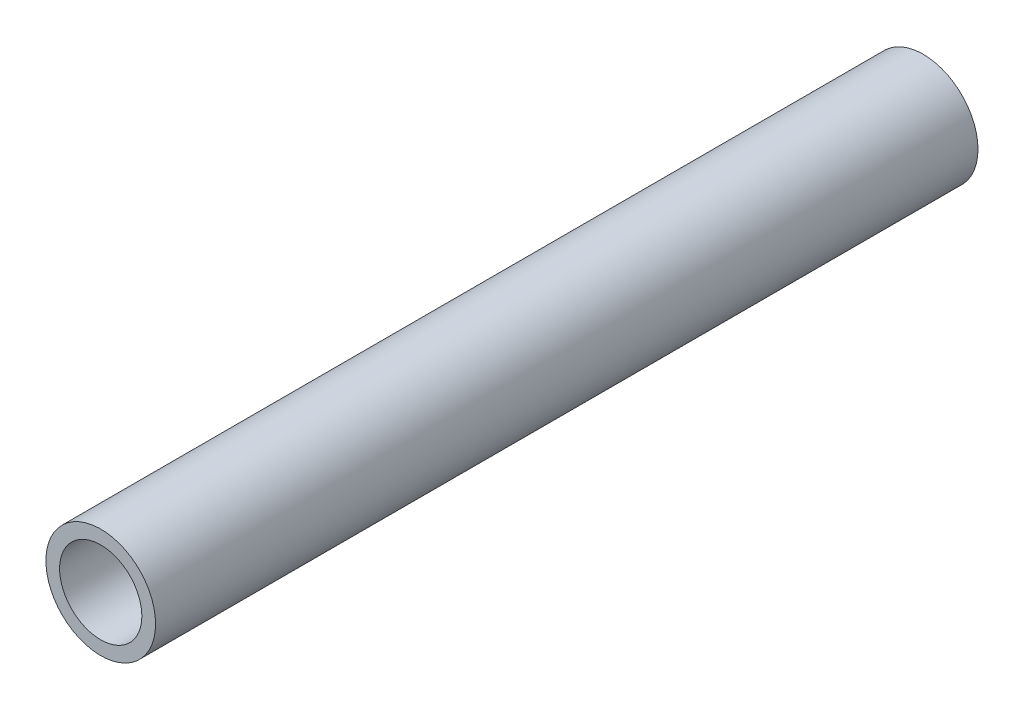
ISO-10303-21;
HEADER;
FILE_DESCRIPTION(('STEP AP214'),'2;1');
FILE_NAME('part.step','',(''),(''),'','','');
FILE_SCHEMA(('AUTOMOTIVE_DESIGN { 1 0 10303 214 1 1 1 1 }'));
ENDSEC;
DATA;
#1=APPLICATION_CONTEXT('core data for automotive mechanical design processes');
#2=APPLICATION_PROTOCOL_DEFINITION('international standard','automotive_design',2000,#1);
#3=PRODUCT_CONTEXT('',#1,'mechanical');
#4=PRODUCT('Part','Part','',(#3));
#5=PRODUCT_RELATED_PRODUCT_CATEGORY('part','',(#4));
#6=PRODUCT_DEFINITION_FORMATION('','',#4);
#7=PRODUCT_DEFINITION_CONTEXT('part definition',#1,'design');
#8=PRODUCT_DEFINITION('design','',#6,#7);
#9=PRODUCT_DEFINITION_SHAPE('','',#8);
#10=(LENGTH_UNIT() NAMED_UNIT(*) SI_UNIT(.MILLI.,.METRE.));
#11=(NAMED_UNIT(*) PLANE_ANGLE_UNIT() SI_UNIT($,.RADIAN.));
#12=(NAMED_UNIT(*) SI_UNIT($,.STERADIAN.) SOLID_ANGLE_UNIT());
#13=UNCERTAINTY_MEASURE_WITH_UNIT(LENGTH_MEASURE(1.E-05),#10,'distance_accuracy_value','');
#14=(GEOMETRIC_REPRESENTATION_CONTEXT(3) GLOBAL_UNCERTAINTY_ASSIGNED_CONTEXT((#13)) GLOBAL_UNIT_ASSIGNED_CONTEXT((#10,
#11,#12)) REPRESENTATION_CONTEXT('',''));
#15=CARTESIAN_POINT('',(0.,0.,0.));
#16=DIRECTION('',(0.,0.,1.));
#17=DIRECTION('',(1.,0.,0.));
#18=AXIS2_PLACEMENT_3D('',#15,#16,#17);
#19=CARTESIAN_POINT('',(0.,0.,60.));
#20=DIRECTION('',(0.,0.,-1.));
#21=DIRECTION('',(-1.,0.,0.));
#22=AXIS2_PLACEMENT_3D('',#19,#20,#21);
#23=CYLINDRICAL_SURFACE('',#22,4.);
#24=CARTESIAN_POINT('',(0.,0.,60.));
#25=DIRECTION('',(0.,0.,1.));
#26=DIRECTION('',(1.,0.,0.));
#27=AXIS2_PLACEMENT_3D('',#24,#25,#26);
#28=CIRCLE('',#27,4.);
#29=CARTESIAN_POINT('',(4.,0.,60.));
#30=VERTEX_POINT('',#29);
#31=EDGE_CURVE('E10',#30,#30,#28,.T.);
#32=ORIENTED_EDGE('',*,*,#31,.F.);
#33=EDGE_LOOP('',(#32));
#34=FACE_BOUND('',#33,.T.);
#35=CARTESIAN_POINT('',(0.,0.,0.));
#36=DIRECTION('',(0.,0.,1.));
#37=DIRECTION('',(1.,0.,0.));
#38=AXIS2_PLACEMENT_3D('',#35,#36,#37);
#39=CIRCLE('',#38,4.);
#40=CARTESIAN_POINT('',(4.,0.,0.));
#41=VERTEX_POINT('',#40);
#42=EDGE_CURVE('E40',#41,#41,#39,.T.);
#43=ORIENTED_EDGE('',*,*,#42,.T.);
#44=EDGE_LOOP('',(#43));
#45=FACE_BOUND('',#44,.T.);
#46=ADVANCED_FACE('F37',(#34,#45),#23,.T.);
#47=CARTESIAN_POINT('',(0.,0.,60.));
#48=DIRECTION('',(0.,0.,1.));
#49=DIRECTION('',(1.,0.,0.));
#50=AXIS2_PLACEMENT_3D('',#47,#48,#49);
#51=PLANE('',#50);
#52=CARTESIAN_POINT('',(0.,0.,60.));
#53=DIRECTION('',(0.,0.,1.));
#54=DIRECTION('',(1.,0.,0.));
#55=AXIS2_PLACEMENT_3D('',#52,#53,#54);
#56=CIRCLE('',#55,3.);
#57=CARTESIAN_POINT('',(3.,0.,60.));
#58=VERTEX_POINT('',#57);
#59=EDGE_CURVE('E51',#58,#58,#56,.T.);
#60=ORIENTED_EDGE('',*,*,#59,.F.);
#61=EDGE_LOOP('',(#60));
#62=FACE_BOUND('',#61,.T.);
#63=ORIENTED_EDGE('',*,*,#31,.T.);
#64=EDGE_LOOP('',(#63));
#65=FACE_BOUND('',#64,.T.);
#66=ADVANCED_FACE('F68',(#62,#65),#51,.T.);
#67=CARTESIAN_POINT('',(0.,0.,0.));
#68=DIRECTION('',(0.,0.,1.));
#69=DIRECTION('',(1.,0.,0.));
#70=AXIS2_PLACEMENT_3D('',#67,#68,#69);
#71=PLANE('',#70);
#72=ORIENTED_EDGE('',*,*,#42,.F.);
#73=EDGE_LOOP('',(#72));
#74=FACE_BOUND('',#73,.T.);
#75=ADVANCED_FACE('F64',(#74),#71,.F.);
#76=CARTESIAN_POINT('',(0.,0.,55.));
#77=DIRECTION('',(0.,0.,1.));
#78=DIRECTION('',(1.,0.,0.));
#79=AXIS2_PLACEMENT_3D('',#76,#77,#78);
#80=CYLINDRICAL_SURFACE('',#79,3.);
#81=CARTESIAN_POINT('',(0.,0.,55.));
#82=DIRECTION('',(0.,0.,1.));
#83=DIRECTION('',(1.,0.,0.));
#84=AXIS2_PLACEMENT_3D('',#81,#82,#83);
#85=CIRCLE('',#84,3.);
#86=CARTESIAN_POINT('',(3.,0.,55.));
#87=VERTEX_POINT('',#86);
#88=EDGE_CURVE('E49',#87,#87,#85,.T.);
#89=ORIENTED_EDGE('',*,*,#88,.F.);
#90=EDGE_LOOP('',(#89));
#91=FACE_BOUND('',#90,.T.);
#92=ORIENTED_EDGE('',*,*,#59,.T.);
#93=EDGE_LOOP('',(#92));
#94=FACE_BOUND('',#93,.T.);
#95=ADVANCED_FACE('F61',(#91,#94),#80,.F.);
#96=CARTESIAN_POINT('',(0.,0.,55.));
#97=DIRECTION('',(0.,0.,1.));
#98=DIRECTION('',(1.,0.,0.));
#99=AXIS2_PLACEMENT_3D('',#96,#97,#98);
#100=PLANE('',#99);
#101=ORIENTED_EDGE('',*,*,#88,.T.);
#102=EDGE_LOOP('',(#101));
#103=FACE_BOUND('',#102,.T.);
#104=ADVANCED_FACE('F59',(#103),#100,.T.);
#105=CLOSED_SHELL('',(#46,#66,#75,#95,#104));
#106=MANIFOLD_SOLID_BREP('B2',#105);
#107=ADVANCED_BREP_SHAPE_REPRESENTATION('',(#18,#106),#14);
#108=SHAPE_DEFINITION_REPRESENTATION(#9,#107);
ENDSEC;
END-ISO-10303-21;
